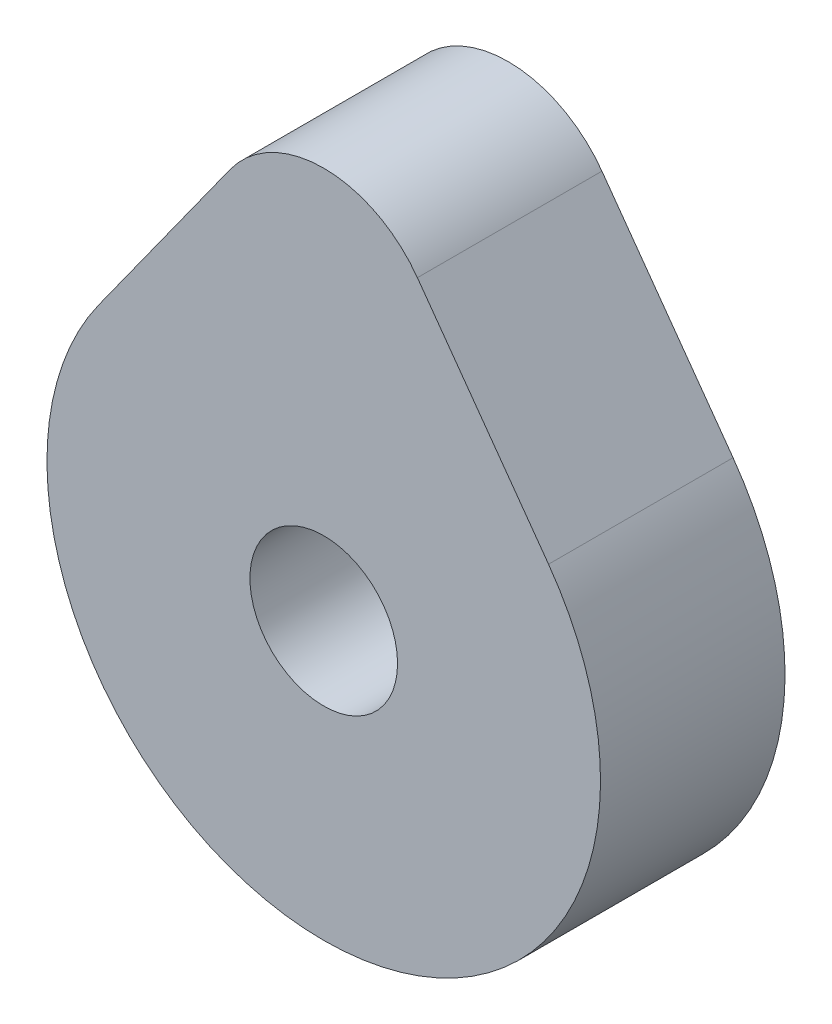
ISO-10303-21;
HEADER;
FILE_DESCRIPTION(('STEP AP214'),'2;1');
FILE_NAME('part.step','',(''),(''),'','','');
FILE_SCHEMA(('AUTOMOTIVE_DESIGN { 1 0 10303 214 1 1 1 1 }'));
ENDSEC;
DATA;
#1=APPLICATION_CONTEXT('core data for automotive mechanical design processes');
#2=APPLICATION_PROTOCOL_DEFINITION('international standard','automotive_design',2000,#1);
#3=PRODUCT_CONTEXT('',#1,'mechanical');
#4=PRODUCT('Part','Part','',(#3));
#5=PRODUCT_RELATED_PRODUCT_CATEGORY('part','',(#4));
#6=PRODUCT_DEFINITION_FORMATION('','',#4);
#7=PRODUCT_DEFINITION_CONTEXT('part definition',#1,'design');
#8=PRODUCT_DEFINITION('design','',#6,#7);
#9=PRODUCT_DEFINITION_SHAPE('','',#8);
#10=(LENGTH_UNIT() NAMED_UNIT(*) SI_UNIT(.MILLI.,.METRE.));
#11=(NAMED_UNIT(*) PLANE_ANGLE_UNIT() SI_UNIT($,.RADIAN.));
#12=(NAMED_UNIT(*) SI_UNIT($,.STERADIAN.) SOLID_ANGLE_UNIT());
#13=UNCERTAINTY_MEASURE_WITH_UNIT(LENGTH_MEASURE(1.E-05),#10,'distance_accuracy_value','');
#14=(GEOMETRIC_REPRESENTATION_CONTEXT(3) GLOBAL_UNCERTAINTY_ASSIGNED_CONTEXT((#13)) GLOBAL_UNIT_ASSIGNED_CONTEXT((#10,
#11,#12)) REPRESENTATION_CONTEXT('',''));
#15=CARTESIAN_POINT('',(0.,0.,0.));
#16=DIRECTION('',(0.,0.,1.));
#17=DIRECTION('',(1.,0.,0.));
#18=AXIS2_PLACEMENT_3D('',#15,#16,#17);
#19=CARTESIAN_POINT('',(0.,0.,10.));
#20=DIRECTION('',(0.,0.,1.));
#21=DIRECTION('',(1.,0.,0.));
#22=AXIS2_PLACEMENT_3D('',#19,#20,#21);
#23=PLANE('',#22);
#24=CARTESIAN_POINT('',(0.,0.,10.));
#25=DIRECTION('',(0.,0.,1.));
#26=DIRECTION('',(1.,0.,0.));
#27=AXIS2_PLACEMENT_3D('',#24,#25,#26);
#28=CIRCLE('',#27,15.);
#29=CARTESIAN_POINT('',(-12.1834929310112,8.75,10.));
#30=VERTEX_POINT('',#29);
#31=CARTESIAN_POINT('',(12.1834929310112,8.75,10.));
#32=VERTEX_POINT('',#31);
#33=EDGE_CURVE('E91',#30,#32,#28,.T.);
#34=ORIENTED_EDGE('',*,*,#33,.T.);
#35=DIRECTION('',(-0.583333333333334,0.812232862067414,0.));
#36=VECTOR('',#35,1.);
#37=CARTESIAN_POINT('',(12.1834929310112,8.75,10.));
#38=LINE('',#37,#36);
#39=CARTESIAN_POINT('',(5.07645538792133,18.6458333333333,10.));
#40=VERTEX_POINT('',#39);
#41=EDGE_CURVE('E86',#32,#40,#38,.T.);
#42=ORIENTED_EDGE('',*,*,#41,.T.);
#43=CARTESIAN_POINT('',(0.,15.,10.));
#44=DIRECTION('',(0.,0.,1.));
#45=DIRECTION('',(1.,0.,0.));
#46=AXIS2_PLACEMENT_3D('',#43,#44,#45);
#47=CIRCLE('',#46,6.25);
#48=CARTESIAN_POINT('',(-5.07645538792133,18.6458333333333,10.));
#49=VERTEX_POINT('',#48);
#50=EDGE_CURVE('E89',#40,#49,#47,.T.);
#51=ORIENTED_EDGE('',*,*,#50,.T.);
#52=DIRECTION('',(-0.583333333333333,-0.812232862067413,0.));
#53=VECTOR('',#52,1.);
#54=CARTESIAN_POINT('',(-12.1834929310112,8.75,10.));
#55=LINE('',#54,#53);
#56=EDGE_CURVE('E56',#49,#30,#55,.T.);
#57=ORIENTED_EDGE('',*,*,#56,.T.);
#58=EDGE_LOOP('',(#34,#42,#51,#57));
#59=FACE_BOUND('',#58,.T.);
#60=CARTESIAN_POINT('',(0.,0.,10.));
#61=DIRECTION('',(0.,0.,1.));
#62=DIRECTION('',(1.,0.,0.));
#63=AXIS2_PLACEMENT_3D('',#60,#61,#62);
#64=CIRCLE('',#63,4.);
#65=CARTESIAN_POINT('',(4.,0.,10.));
#66=VERTEX_POINT('',#65);
#67=EDGE_CURVE('E106',#66,#66,#64,.T.);
#68=ORIENTED_EDGE('',*,*,#67,.F.);
#69=EDGE_LOOP('',(#68));
#70=FACE_BOUND('',#69,.T.);
#71=ADVANCED_FACE('F39',(#59,#70),#23,.T.);
#72=CARTESIAN_POINT('',(0.,0.,0.));
#73=DIRECTION('',(0.,0.,1.));
#74=DIRECTION('',(1.,0.,0.));
#75=AXIS2_PLACEMENT_3D('',#72,#73,#74);
#76=PLANE('',#75);
#77=CARTESIAN_POINT('',(0.,0.,0.));
#78=DIRECTION('',(0.,0.,1.));
#79=DIRECTION('',(1.,0.,0.));
#80=AXIS2_PLACEMENT_3D('',#77,#78,#79);
#81=CIRCLE('',#80,15.);
#82=CARTESIAN_POINT('',(-12.1834929310112,8.75,0.));
#83=VERTEX_POINT('',#82);
#84=CARTESIAN_POINT('',(12.1834929310112,8.75,0.));
#85=VERTEX_POINT('',#84);
#86=EDGE_CURVE('E103',#83,#85,#81,.T.);
#87=ORIENTED_EDGE('',*,*,#86,.F.);
#88=DIRECTION('',(-0.583333333333333,-0.812232862067413,0.));
#89=VECTOR('',#88,1.);
#90=CARTESIAN_POINT('',(-12.1834929310112,8.75,0.));
#91=LINE('',#90,#89);
#92=CARTESIAN_POINT('',(-5.07645538792133,18.6458333333333,0.));
#93=VERTEX_POINT('',#92);
#94=EDGE_CURVE('E79',#93,#83,#91,.T.);
#95=ORIENTED_EDGE('',*,*,#94,.F.);
#96=CARTESIAN_POINT('',(0.,15.,0.));
#97=DIRECTION('',(0.,0.,1.));
#98=DIRECTION('',(1.,0.,0.));
#99=AXIS2_PLACEMENT_3D('',#96,#97,#98);
#100=CIRCLE('',#99,6.25);
#101=CARTESIAN_POINT('',(5.07645538792133,18.6458333333333,0.));
#102=VERTEX_POINT('',#101);
#103=EDGE_CURVE('E73',#102,#93,#100,.T.);
#104=ORIENTED_EDGE('',*,*,#103,.F.);
#105=DIRECTION('',(-0.583333333333334,0.812232862067414,0.));
#106=VECTOR('',#105,1.);
#107=CARTESIAN_POINT('',(12.1834929310112,8.75,0.));
#108=LINE('',#107,#106);
#109=EDGE_CURVE('E95',#85,#102,#108,.T.);
#110=ORIENTED_EDGE('',*,*,#109,.F.);
#111=EDGE_LOOP('',(#87,#95,#104,#110));
#112=FACE_BOUND('',#111,.T.);
#113=CARTESIAN_POINT('',(0.,0.,0.));
#114=DIRECTION('',(0.,0.,1.));
#115=DIRECTION('',(1.,0.,0.));
#116=AXIS2_PLACEMENT_3D('',#113,#114,#115);
#117=CIRCLE('',#116,4.);
#118=CARTESIAN_POINT('',(4.,0.,0.));
#119=VERTEX_POINT('',#118);
#120=EDGE_CURVE('E118',#119,#119,#117,.T.);
#121=ORIENTED_EDGE('',*,*,#120,.T.);
#122=EDGE_LOOP('',(#121));
#123=FACE_BOUND('',#122,.T.);
#124=ADVANCED_FACE('F114',(#112,#123),#76,.F.);
#125=CARTESIAN_POINT('',(0.,0.,10.));
#126=DIRECTION('',(0.,0.,-1.));
#127=DIRECTION('',(-1.,0.,0.));
#128=AXIS2_PLACEMENT_3D('',#125,#126,#127);
#129=CYLINDRICAL_SURFACE('',#128,15.);
#130=ORIENTED_EDGE('',*,*,#86,.T.);
#131=DIRECTION('',(0.,0.,-1.));
#132=VECTOR('',#131,1.);
#133=CARTESIAN_POINT('',(12.1834929310112,8.75,10.));
#134=LINE('',#133,#132);
#135=EDGE_CURVE('E11',#32,#85,#134,.T.);
#136=ORIENTED_EDGE('',*,*,#135,.F.);
#137=ORIENTED_EDGE('',*,*,#33,.F.);
#138=DIRECTION('',(0.,0.,-1.));
#139=VECTOR('',#138,1.);
#140=CARTESIAN_POINT('',(-12.1834929310112,8.75,10.));
#141=LINE('',#140,#139);
#142=EDGE_CURVE('E99',#30,#83,#141,.T.);
#143=ORIENTED_EDGE('',*,*,#142,.T.);
#144=EDGE_LOOP('',(#130,#136,#137,#143));
#145=FACE_BOUND('',#144,.T.);
#146=ADVANCED_FACE('F41',(#145),#129,.T.);
#147=CARTESIAN_POINT('',(12.1834929310112,8.75,10.));
#148=DIRECTION('',(-0.812232862067414,-0.583333333333334,0.));
#149=DIRECTION('',(0.583333333333334,-0.812232862067414,0.));
#150=AXIS2_PLACEMENT_3D('',#147,#148,#149);
#151=PLANE('',#150);
#152=ORIENTED_EDGE('',*,*,#109,.T.);
#153=DIRECTION('',(0.,0.,-1.));
#154=VECTOR('',#153,1.);
#155=CARTESIAN_POINT('',(5.07645538792133,18.6458333333333,10.));
#156=LINE('',#155,#154);
#157=EDGE_CURVE('E48',#40,#102,#156,.T.);
#158=ORIENTED_EDGE('',*,*,#157,.F.);
#159=ORIENTED_EDGE('',*,*,#41,.F.);
#160=ORIENTED_EDGE('',*,*,#135,.T.);
#161=EDGE_LOOP('',(#152,#158,#159,#160));
#162=FACE_BOUND('',#161,.T.);
#163=ADVANCED_FACE('F94',(#162),#151,.F.);
#164=CARTESIAN_POINT('',(0.,15.,10.));
#165=DIRECTION('',(0.,0.,-1.));
#166=DIRECTION('',(-1.,0.,0.));
#167=AXIS2_PLACEMENT_3D('',#164,#165,#166);
#168=CYLINDRICAL_SURFACE('',#167,6.25);
#169=ORIENTED_EDGE('',*,*,#103,.T.);
#170=DIRECTION('',(0.,0.,-1.));
#171=VECTOR('',#170,1.);
#172=CARTESIAN_POINT('',(-5.07645538792133,18.6458333333333,10.));
#173=LINE('',#172,#171);
#174=EDGE_CURVE('E96',#49,#93,#173,.T.);
#175=ORIENTED_EDGE('',*,*,#174,.F.);
#176=ORIENTED_EDGE('',*,*,#50,.F.);
#177=ORIENTED_EDGE('',*,*,#157,.T.);
#178=EDGE_LOOP('',(#169,#175,#176,#177));
#179=FACE_BOUND('',#178,.T.);
#180=ADVANCED_FACE('F97',(#179),#168,.T.);
#181=CARTESIAN_POINT('',(-12.1834929310112,8.75,10.));
#182=DIRECTION('',(0.812232862067413,-0.583333333333334,0.));
#183=DIRECTION('',(0.583333333333334,0.812232862067414,0.));
#184=AXIS2_PLACEMENT_3D('',#181,#182,#183);
#185=PLANE('',#184);
#186=ORIENTED_EDGE('',*,*,#94,.T.);
#187=ORIENTED_EDGE('',*,*,#142,.F.);
#188=ORIENTED_EDGE('',*,*,#56,.F.);
#189=ORIENTED_EDGE('',*,*,#174,.T.);
#190=EDGE_LOOP('',(#186,#187,#188,#189));
#191=FACE_BOUND('',#190,.T.);
#192=ADVANCED_FACE('F111',(#191),#185,.F.);
#193=CARTESIAN_POINT('',(0.,0.,10.));
#194=DIRECTION('',(0.,0.,-1.));
#195=DIRECTION('',(-1.,0.,0.));
#196=AXIS2_PLACEMENT_3D('',#193,#194,#195);
#197=CYLINDRICAL_SURFACE('',#196,4.);
#198=ORIENTED_EDGE('',*,*,#67,.T.);
#199=EDGE_LOOP('',(#198));
#200=FACE_BOUND('',#199,.T.);
#201=ORIENTED_EDGE('',*,*,#120,.F.);
#202=EDGE_LOOP('',(#201));
#203=FACE_BOUND('',#202,.T.);
#204=ADVANCED_FACE('F124',(#200,#203),#197,.F.);
#205=CLOSED_SHELL('',(#71,#124,#146,#163,#180,#192,#204));
#206=MANIFOLD_SOLID_BREP('B2',#205);
#207=ADVANCED_BREP_SHAPE_REPRESENTATION('',(#18,#206),#14);
#208=SHAPE_DEFINITION_REPRESENTATION(#9,#207);
ENDSEC;
END-ISO-10303-21;
